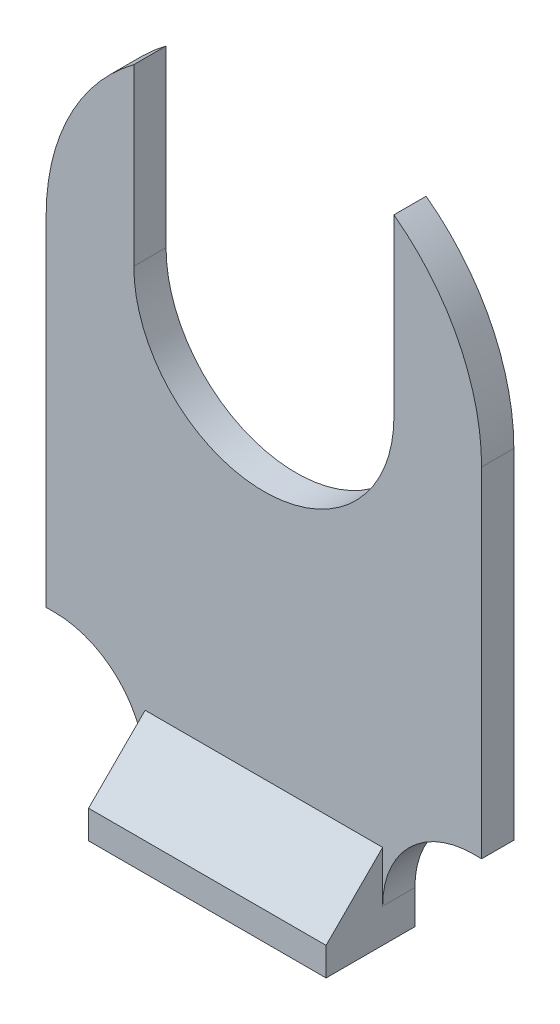
ISO-10303-21;
HEADER;
FILE_DESCRIPTION(('STEP AP214'),'2;1');
FILE_NAME('part.step','',(''),(''),'','','');
FILE_SCHEMA(('AUTOMOTIVE_DESIGN { 1 0 10303 214 1 1 1 1 }'));
ENDSEC;
DATA;
#1=APPLICATION_CONTEXT('core data for automotive mechanical design processes');
#2=APPLICATION_PROTOCOL_DEFINITION('international standard','automotive_design',2000,#1);
#3=PRODUCT_CONTEXT('',#1,'mechanical');
#4=PRODUCT('Part','Part','',(#3));
#5=PRODUCT_RELATED_PRODUCT_CATEGORY('part','',(#4));
#6=PRODUCT_DEFINITION_FORMATION('','',#4);
#7=PRODUCT_DEFINITION_CONTEXT('part definition',#1,'design');
#8=PRODUCT_DEFINITION('design','',#6,#7);
#9=PRODUCT_DEFINITION_SHAPE('','',#8);
#10=(LENGTH_UNIT() NAMED_UNIT(*) SI_UNIT(.MILLI.,.METRE.));
#11=(NAMED_UNIT(*) PLANE_ANGLE_UNIT() SI_UNIT($,.RADIAN.));
#12=(NAMED_UNIT(*) SI_UNIT($,.STERADIAN.) SOLID_ANGLE_UNIT());
#13=UNCERTAINTY_MEASURE_WITH_UNIT(LENGTH_MEASURE(1.E-05),#10,'distance_accuracy_value','');
#14=(GEOMETRIC_REPRESENTATION_CONTEXT(3) GLOBAL_UNCERTAINTY_ASSIGNED_CONTEXT((#13)) GLOBAL_UNIT_ASSIGNED_CONTEXT((#10,
#11,#12)) REPRESENTATION_CONTEXT('',''));
#15=CARTESIAN_POINT('',(0.,0.,0.));
#16=DIRECTION('',(0.,0.,1.));
#17=DIRECTION('',(1.,0.,0.));
#18=AXIS2_PLACEMENT_3D('',#15,#16,#17);
#19=CARTESIAN_POINT('',(0.,0.,1.24));
#20=DIRECTION('',(0.,0.,-1.));
#21=DIRECTION('',(-1.,0.,0.));
#22=AXIS2_PLACEMENT_3D('',#19,#20,#21);
#23=CYLINDRICAL_SURFACE('',#22,4.6);
#24=CARTESIAN_POINT('',(0.,0.,0.1));
#25=DIRECTION('',(0.,0.,1.));
#26=DIRECTION('',(-1.,0.,0.));
#27=AXIS2_PLACEMENT_3D('',#24,#25,#26);
#28=CIRCLE('',#27,4.6);
#29=CARTESIAN_POINT('',(-4.6,0.,0.1));
#30=VERTEX_POINT('',#29);
#31=CARTESIAN_POINT('',(4.6,0.,0.1));
#32=VERTEX_POINT('',#31);
#33=EDGE_CURVE('E271',#30,#32,#28,.T.);
#34=ORIENTED_EDGE('',*,*,#33,.F.);
#35=DIRECTION('',(0.,0.,-1.));
#36=VECTOR('',#35,1.);
#37=CARTESIAN_POINT('',(-4.6,0.,1.24));
#38=LINE('',#37,#36);
#39=CARTESIAN_POINT('',(-4.6,0.,1.24));
#40=VERTEX_POINT('',#39);
#41=EDGE_CURVE('E220',#40,#30,#38,.T.);
#42=ORIENTED_EDGE('',*,*,#41,.F.);
#43=CARTESIAN_POINT('',(0.,0.,1.24));
#44=DIRECTION('',(0.,0.,-1.));
#45=DIRECTION('',(1.,0.,0.));
#46=AXIS2_PLACEMENT_3D('',#43,#44,#45);
#47=CIRCLE('',#46,4.6);
#48=CARTESIAN_POINT('',(4.6,0.,1.24));
#49=VERTEX_POINT('',#48);
#50=EDGE_CURVE('E186',#49,#40,#47,.T.);
#51=ORIENTED_EDGE('',*,*,#50,.F.);
#52=DIRECTION('',(0.,0.,-1.));
#53=VECTOR('',#52,1.);
#54=CARTESIAN_POINT('',(4.6,0.,1.24));
#55=LINE('',#54,#53);
#56=EDGE_CURVE('E205',#49,#32,#55,.T.);
#57=ORIENTED_EDGE('',*,*,#56,.T.);
#58=EDGE_LOOP('',(#34,#42,#51,#57));
#59=FACE_BOUND('',#58,.T.);
#60=ADVANCED_FACE('F36',(#59),#23,.F.);
#61=CARTESIAN_POINT('',(-4.6,0.,1.24));
#62=DIRECTION('',(-1.,0.,0.));
#63=DIRECTION('',(0.,0.,1.));
#64=AXIS2_PLACEMENT_3D('',#61,#62,#63);
#65=PLANE('',#64);
#66=DIRECTION('',(0.,-1.,0.));
#67=VECTOR('',#66,1.);
#68=CARTESIAN_POINT('',(-4.6,6.17494939250517,0.1));
#69=LINE('',#68,#67);
#70=CARTESIAN_POINT('',(-4.6,6.17494939250517,0.1));
#71=VERTEX_POINT('',#70);
#72=EDGE_CURVE('E273',#71,#30,#69,.T.);
#73=ORIENTED_EDGE('',*,*,#72,.F.);
#74=DIRECTION('',(0.,0.,-1.));
#75=VECTOR('',#74,1.);
#76=CARTESIAN_POINT('',(-4.6,6.17494939250517,1.24));
#77=LINE('',#76,#75);
#78=CARTESIAN_POINT('',(-4.6,6.17494939250517,1.24));
#79=VERTEX_POINT('',#78);
#80=EDGE_CURVE('E217',#79,#71,#77,.T.);
#81=ORIENTED_EDGE('',*,*,#80,.F.);
#82=DIRECTION('',(0.,1.,0.));
#83=VECTOR('',#82,1.);
#84=CARTESIAN_POINT('',(-4.6,0.,1.24));
#85=LINE('',#84,#83);
#86=EDGE_CURVE('E192',#40,#79,#85,.T.);
#87=ORIENTED_EDGE('',*,*,#86,.F.);
#88=ORIENTED_EDGE('',*,*,#41,.T.);
#89=EDGE_LOOP('',(#73,#81,#87,#88));
#90=FACE_BOUND('',#89,.T.);
#91=ADVANCED_FACE('F300',(#90),#65,.F.);
#92=CARTESIAN_POINT('',(0.,0.,1.24));
#93=DIRECTION('',(0.,0.,-1.));
#94=DIRECTION('',(-1.,0.,0.));
#95=AXIS2_PLACEMENT_3D('',#92,#93,#94);
#96=CYLINDRICAL_SURFACE('',#95,7.7);
#97=CARTESIAN_POINT('',(0.,0.,0.1));
#98=DIRECTION('',(0.,0.,-1.));
#99=DIRECTION('',(-1.,0.,0.));
#100=AXIS2_PLACEMENT_3D('',#97,#98,#99);
#101=CIRCLE('',#100,7.7);
#102=CARTESIAN_POINT('',(-7.7,0.,0.1));
#103=VERTEX_POINT('',#102);
#104=EDGE_CURVE('E275',#103,#71,#101,.T.);
#105=ORIENTED_EDGE('',*,*,#104,.F.);
#106=DIRECTION('',(0.,0.,-1.));
#107=VECTOR('',#106,1.);
#108=CARTESIAN_POINT('',(-7.7,0.,1.24));
#109=LINE('',#108,#107);
#110=CARTESIAN_POINT('',(-7.7,0.,1.24));
#111=VERTEX_POINT('',#110);
#112=EDGE_CURVE('E214',#111,#103,#109,.T.);
#113=ORIENTED_EDGE('',*,*,#112,.F.);
#114=CARTESIAN_POINT('',(0.,0.,1.24));
#115=DIRECTION('',(0.,0.,1.));
#116=DIRECTION('',(1.,0.,0.));
#117=AXIS2_PLACEMENT_3D('',#114,#115,#116);
#118=CIRCLE('',#117,7.7);
#119=EDGE_CURVE('E194',#79,#111,#118,.T.);
#120=ORIENTED_EDGE('',*,*,#119,.F.);
#121=ORIENTED_EDGE('',*,*,#80,.T.);
#122=EDGE_LOOP('',(#105,#113,#120,#121));
#123=FACE_BOUND('',#122,.T.);
#124=ADVANCED_FACE('F305',(#123),#96,.T.);
#125=CARTESIAN_POINT('',(-7.7,-20.6,1.24));
#126=DIRECTION('',(1.,0.,0.));
#127=DIRECTION('',(0.,1.,0.));
#128=AXIS2_PLACEMENT_3D('',#125,#126,#127);
#129=PLANE('',#128);
#130=DIRECTION('',(0.,1.,0.));
#131=VECTOR('',#130,1.);
#132=CARTESIAN_POINT('',(-7.7,-12.,0.1));
#133=LINE('',#132,#131);
#134=CARTESIAN_POINT('',(-7.7,-12.,0.1));
#135=VERTEX_POINT('',#134);
#136=EDGE_CURVE('E277',#135,#103,#133,.T.);
#137=ORIENTED_EDGE('',*,*,#136,.F.);
#138=DIRECTION('',(0.,0.,1.));
#139=VECTOR('',#138,1.);
#140=CARTESIAN_POINT('',(-7.7,-12.,-9.28493403315286));
#141=LINE('',#140,#139);
#142=CARTESIAN_POINT('',(-7.7,-12.,1.24));
#143=VERTEX_POINT('',#142);
#144=EDGE_CURVE('E184',#135,#143,#141,.T.);
#145=ORIENTED_EDGE('',*,*,#144,.T.);
#146=DIRECTION('',(0.,-1.,0.));
#147=VECTOR('',#146,1.);
#148=CARTESIAN_POINT('',(-7.7,-20.6,1.24));
#149=LINE('',#148,#147);
#150=EDGE_CURVE('E196',#111,#143,#149,.T.);
#151=ORIENTED_EDGE('',*,*,#150,.F.);
#152=ORIENTED_EDGE('',*,*,#112,.T.);
#153=EDGE_LOOP('',(#137,#145,#151,#152));
#154=FACE_BOUND('',#153,.T.);
#155=ADVANCED_FACE('F312',(#154),#129,.F.);
#156=CARTESIAN_POINT('',(7.7,-20.6,1.24));
#157=DIRECTION('',(-1.,0.,0.));
#158=DIRECTION('',(0.,-1.,0.));
#159=AXIS2_PLACEMENT_3D('',#156,#157,#158);
#160=PLANE('',#159);
#161=DIRECTION('',(0.,-1.,0.));
#162=VECTOR('',#161,1.);
#163=CARTESIAN_POINT('',(7.7,0.,0.1));
#164=LINE('',#163,#162);
#165=CARTESIAN_POINT('',(7.7,0.,0.1));
#166=VERTEX_POINT('',#165);
#167=CARTESIAN_POINT('',(7.7,-12.,0.1));
#168=VERTEX_POINT('',#167);
#169=EDGE_CURVE('E244',#166,#168,#164,.T.);
#170=ORIENTED_EDGE('',*,*,#169,.F.);
#171=DIRECTION('',(0.,0.,-1.));
#172=VECTOR('',#171,1.);
#173=CARTESIAN_POINT('',(7.7,0.,1.24));
#174=LINE('',#173,#172);
#175=CARTESIAN_POINT('',(7.7,0.,1.24));
#176=VERTEX_POINT('',#175);
#177=EDGE_CURVE('E211',#176,#166,#174,.T.);
#178=ORIENTED_EDGE('',*,*,#177,.F.);
#179=DIRECTION('',(0.,1.,0.));
#180=VECTOR('',#179,1.);
#181=CARTESIAN_POINT('',(7.7,-20.6,1.24));
#182=LINE('',#181,#180);
#183=CARTESIAN_POINT('',(7.7,-12.,1.24));
#184=VERTEX_POINT('',#183);
#185=EDGE_CURVE('E199',#184,#176,#182,.T.);
#186=ORIENTED_EDGE('',*,*,#185,.F.);
#187=DIRECTION('',(0.,0.,1.));
#188=VECTOR('',#187,1.);
#189=CARTESIAN_POINT('',(7.7,-12.,-9.28493403315286));
#190=LINE('',#189,#188);
#191=EDGE_CURVE('E168',#168,#184,#190,.T.);
#192=ORIENTED_EDGE('',*,*,#191,.F.);
#193=EDGE_LOOP('',(#170,#178,#186,#192));
#194=FACE_BOUND('',#193,.T.);
#195=ADVANCED_FACE('F316',(#194),#160,.F.);
#196=CARTESIAN_POINT('',(0.,0.,1.24));
#197=DIRECTION('',(0.,0.,-1.));
#198=DIRECTION('',(-1.,0.,0.));
#199=AXIS2_PLACEMENT_3D('',#196,#197,#198);
#200=CYLINDRICAL_SURFACE('',#199,7.7);
#201=CARTESIAN_POINT('',(0.,0.,0.1));
#202=DIRECTION('',(0.,0.,-1.));
#203=DIRECTION('',(-1.,0.,0.));
#204=AXIS2_PLACEMENT_3D('',#201,#202,#203);
#205=CIRCLE('',#204,7.7);
#206=CARTESIAN_POINT('',(4.6,6.17494939250517,0.1));
#207=VERTEX_POINT('',#206);
#208=EDGE_CURVE('E267',#207,#166,#205,.T.);
#209=ORIENTED_EDGE('',*,*,#208,.F.);
#210=DIRECTION('',(0.,0.,-1.));
#211=VECTOR('',#210,1.);
#212=CARTESIAN_POINT('',(4.6,6.17494939250517,1.24));
#213=LINE('',#212,#211);
#214=CARTESIAN_POINT('',(4.6,6.17494939250517,1.24));
#215=VERTEX_POINT('',#214);
#216=EDGE_CURVE('E208',#215,#207,#213,.T.);
#217=ORIENTED_EDGE('',*,*,#216,.F.);
#218=CARTESIAN_POINT('',(0.,0.,1.24));
#219=DIRECTION('',(0.,0.,1.));
#220=DIRECTION('',(1.,0.,0.));
#221=AXIS2_PLACEMENT_3D('',#218,#219,#220);
#222=CIRCLE('',#221,7.7);
#223=EDGE_CURVE('E201',#176,#215,#222,.T.);
#224=ORIENTED_EDGE('',*,*,#223,.F.);
#225=ORIENTED_EDGE('',*,*,#177,.T.);
#226=EDGE_LOOP('',(#209,#217,#224,#225));
#227=FACE_BOUND('',#226,.T.);
#228=ADVANCED_FACE('F320',(#227),#200,.T.);
#229=CARTESIAN_POINT('',(4.6,0.,1.24));
#230=DIRECTION('',(1.,0.,0.));
#231=DIRECTION('',(0.,0.,-1.));
#232=AXIS2_PLACEMENT_3D('',#229,#230,#231);
#233=PLANE('',#232);
#234=DIRECTION('',(0.,1.,0.));
#235=VECTOR('',#234,1.);
#236=CARTESIAN_POINT('',(4.6,0.,0.1));
#237=LINE('',#236,#235);
#238=EDGE_CURVE('E269',#32,#207,#237,.T.);
#239=ORIENTED_EDGE('',*,*,#238,.F.);
#240=ORIENTED_EDGE('',*,*,#56,.F.);
#241=DIRECTION('',(0.,-1.,0.));
#242=VECTOR('',#241,1.);
#243=CARTESIAN_POINT('',(4.6,0.,1.24));
#244=LINE('',#243,#242);
#245=EDGE_CURVE('E203',#215,#49,#244,.T.);
#246=ORIENTED_EDGE('',*,*,#245,.F.);
#247=ORIENTED_EDGE('',*,*,#216,.T.);
#248=EDGE_LOOP('',(#239,#240,#246,#247));
#249=FACE_BOUND('',#248,.T.);
#250=ADVANCED_FACE('F324',(#249),#233,.F.);
#251=CARTESIAN_POINT('',(-7.7,-12.,-9.28493403315286));
#252=DIRECTION('',(0.,1.,0.));
#253=DIRECTION('',(-1.,0.,0.));
#254=AXIS2_PLACEMENT_3D('',#251,#252,#253);
#255=PLANE('',#254);
#256=DIRECTION('',(-1.,0.,0.));
#257=VECTOR('',#256,1.);
#258=CARTESIAN_POINT('',(-7.4,-12.,0.1));
#259=LINE('',#258,#257);
#260=CARTESIAN_POINT('',(-7.4,-12.,0.1));
#261=VERTEX_POINT('',#260);
#262=EDGE_CURVE('E279',#261,#135,#259,.T.);
#263=ORIENTED_EDGE('',*,*,#262,.F.);
#264=DIRECTION('',(0.,0.,1.));
#265=VECTOR('',#264,1.);
#266=CARTESIAN_POINT('',(-7.4,-12.,-9.28493403315286));
#267=LINE('',#266,#265);
#268=CARTESIAN_POINT('',(-7.4,-12.,1.24));
#269=VERTEX_POINT('',#268);
#270=EDGE_CURVE('E187',#261,#269,#267,.T.);
#271=ORIENTED_EDGE('',*,*,#270,.T.);
#272=DIRECTION('',(-1.,0.,0.));
#273=VECTOR('',#272,1.);
#274=CARTESIAN_POINT('',(-7.7,-12.,1.24));
#275=LINE('',#274,#273);
#276=EDGE_CURVE('E180',#269,#143,#275,.T.);
#277=ORIENTED_EDGE('',*,*,#276,.T.);
#278=ORIENTED_EDGE('',*,*,#144,.F.);
#279=EDGE_LOOP('',(#263,#271,#277,#278));
#280=FACE_BOUND('',#279,.T.);
#281=ADVANCED_FACE('F327',(#280),#255,.F.);
#282=CARTESIAN_POINT('',(-7.4,-15.2,-9.28493403315286));
#283=DIRECTION('',(0.,0.,1.));
#284=DIRECTION('',(1.,0.,0.));
#285=AXIS2_PLACEMENT_3D('',#282,#283,#284);
#286=CYLINDRICAL_SURFACE('',#285,3.2);
#287=CARTESIAN_POINT('',(-7.4,-15.2,0.1));
#288=DIRECTION('',(0.,0.,1.));
#289=DIRECTION('',(-1.,0.,0.));
#290=AXIS2_PLACEMENT_3D('',#287,#288,#289);
#291=CIRCLE('',#290,3.2);
#292=CARTESIAN_POINT('',(-4.2,-15.2,0.1));
#293=VERTEX_POINT('',#292);
#294=EDGE_CURVE('E281',#293,#261,#291,.T.);
#295=ORIENTED_EDGE('',*,*,#294,.F.);
#296=DIRECTION('',(0.,0.,1.));
#297=VECTOR('',#296,1.);
#298=CARTESIAN_POINT('',(-4.2,-15.2,-9.28493403315286));
#299=LINE('',#298,#297);
#300=CARTESIAN_POINT('',(-4.2,-15.2,1.24));
#301=VERTEX_POINT('',#300);
#302=EDGE_CURVE('E183',#293,#301,#299,.T.);
#303=ORIENTED_EDGE('',*,*,#302,.T.);
#304=CARTESIAN_POINT('',(-7.4,-15.2,1.24));
#305=DIRECTION('',(0.,0.,1.));
#306=DIRECTION('',(1.,0.,0.));
#307=AXIS2_PLACEMENT_3D('',#304,#305,#306);
#308=CIRCLE('',#307,3.2);
#309=EDGE_CURVE('E177',#301,#269,#308,.T.);
#310=ORIENTED_EDGE('',*,*,#309,.T.);
#311=ORIENTED_EDGE('',*,*,#270,.F.);
#312=EDGE_LOOP('',(#295,#303,#310,#311));
#313=FACE_BOUND('',#312,.T.);
#314=ADVANCED_FACE('F332',(#313),#286,.F.);
#315=CARTESIAN_POINT('',(-4.2,-20.6,-9.28493403315286));
#316=DIRECTION('',(1.,0.,0.));
#317=DIRECTION('',(0.,0.,-1.));
#318=AXIS2_PLACEMENT_3D('',#315,#316,#317);
#319=PLANE('',#318);
#320=DIRECTION('',(0.,1.,0.));
#321=VECTOR('',#320,1.);
#322=CARTESIAN_POINT('',(-4.2,-16.4,0.1));
#323=LINE('',#322,#321);
#324=CARTESIAN_POINT('',(-4.2,-16.4,0.1));
#325=VERTEX_POINT('',#324);
#326=EDGE_CURVE('E283',#325,#293,#323,.T.);
#327=ORIENTED_EDGE('',*,*,#326,.F.);
#328=DIRECTION('',(0.,0.,1.));
#329=VECTOR('',#328,1.);
#330=CARTESIAN_POINT('',(-4.2,-16.4,0.));
#331=LINE('',#330,#329);
#332=CARTESIAN_POINT('',(-4.2,-16.4,3.24));
#333=VERTEX_POINT('',#332);
#334=EDGE_CURVE('E249',#325,#333,#331,.T.);
#335=ORIENTED_EDGE('',*,*,#334,.T.);
#336=DIRECTION('',(0.,-1.,0.));
#337=VECTOR('',#336,1.);
#338=CARTESIAN_POINT('',(-4.2,-16.4,3.24));
#339=LINE('',#338,#337);
#340=CARTESIAN_POINT('',(-4.2,-15.4,3.24));
#341=VERTEX_POINT('',#340);
#342=EDGE_CURVE('E234',#341,#333,#339,.T.);
#343=ORIENTED_EDGE('',*,*,#342,.F.);
#344=DIRECTION('',(0.,0.707106781186546,-0.707106781186549));
#345=VECTOR('',#344,1.);
#346=CARTESIAN_POINT('',(-4.2,-15.4,3.24));
#347=LINE('',#346,#345);
#348=CARTESIAN_POINT('',(-4.2,-13.4,1.24));
#349=VERTEX_POINT('',#348);
#350=EDGE_CURVE('E44',#341,#349,#347,.T.);
#351=ORIENTED_EDGE('',*,*,#350,.T.);
#352=DIRECTION('',(0.,-1.,0.));
#353=VECTOR('',#352,1.);
#354=CARTESIAN_POINT('',(-4.2,-16.4,1.24));
#355=LINE('',#354,#353);
#356=EDGE_CURVE('E232',#349,#301,#355,.T.);
#357=ORIENTED_EDGE('',*,*,#356,.T.);
#358=ORIENTED_EDGE('',*,*,#302,.F.);
#359=EDGE_LOOP('',(#327,#335,#343,#351,#357,#358));
#360=FACE_BOUND('',#359,.T.);
#361=ADVANCED_FACE('F230',(#360),#319,.F.);
#362=CARTESIAN_POINT('',(7.4,-15.2,-9.28493403315286));
#363=DIRECTION('',(0.,0.,1.));
#364=DIRECTION('',(1.,0.,0.));
#365=AXIS2_PLACEMENT_3D('',#362,#363,#364);
#366=CYLINDRICAL_SURFACE('',#365,3.2);
#367=CARTESIAN_POINT('',(7.4,-15.2,0.1));
#368=DIRECTION('',(0.,0.,1.));
#369=DIRECTION('',(-1.,0.,0.));
#370=AXIS2_PLACEMENT_3D('',#367,#368,#369);
#371=CIRCLE('',#370,3.2);
#372=CARTESIAN_POINT('',(7.4,-12.,0.1));
#373=VERTEX_POINT('',#372);
#374=CARTESIAN_POINT('',(4.2,-15.2,0.1));
#375=VERTEX_POINT('',#374);
#376=EDGE_CURVE('E146',#373,#375,#371,.T.);
#377=ORIENTED_EDGE('',*,*,#376,.F.);
#378=DIRECTION('',(0.,0.,1.));
#379=VECTOR('',#378,1.);
#380=CARTESIAN_POINT('',(7.4,-12.,-9.28493403315286));
#381=LINE('',#380,#379);
#382=CARTESIAN_POINT('',(7.4,-12.,1.24));
#383=VERTEX_POINT('',#382);
#384=EDGE_CURVE('E171',#373,#383,#381,.T.);
#385=ORIENTED_EDGE('',*,*,#384,.T.);
#386=CARTESIAN_POINT('',(7.4,-15.2,1.24));
#387=DIRECTION('',(0.,0.,1.));
#388=DIRECTION('',(-1.,0.,0.));
#389=AXIS2_PLACEMENT_3D('',#386,#387,#388);
#390=CIRCLE('',#389,3.2);
#391=CARTESIAN_POINT('',(4.2,-15.2,1.24));
#392=VERTEX_POINT('',#391);
#393=EDGE_CURVE('E167',#383,#392,#390,.T.);
#394=ORIENTED_EDGE('',*,*,#393,.T.);
#395=DIRECTION('',(0.,0.,1.));
#396=VECTOR('',#395,1.);
#397=CARTESIAN_POINT('',(4.2,-15.2,-9.28493403315286));
#398=LINE('',#397,#396);
#399=EDGE_CURVE('E158',#375,#392,#398,.T.);
#400=ORIENTED_EDGE('',*,*,#399,.F.);
#401=EDGE_LOOP('',(#377,#385,#394,#400));
#402=FACE_BOUND('',#401,.T.);
#403=ADVANCED_FACE('F165',(#402),#366,.F.);
#404=CARTESIAN_POINT('',(7.7,-12.,-9.28493403315286));
#405=DIRECTION('',(0.,1.,0.));
#406=DIRECTION('',(-1.,0.,0.));
#407=AXIS2_PLACEMENT_3D('',#404,#405,#406);
#408=PLANE('',#407);
#409=DIRECTION('',(-1.,0.,0.));
#410=VECTOR('',#409,1.);
#411=CARTESIAN_POINT('',(7.7,-12.,0.1));
#412=LINE('',#411,#410);
#413=EDGE_CURVE('E149',#168,#373,#412,.T.);
#414=ORIENTED_EDGE('',*,*,#413,.F.);
#415=ORIENTED_EDGE('',*,*,#191,.T.);
#416=DIRECTION('',(-1.,0.,0.));
#417=VECTOR('',#416,1.);
#418=CARTESIAN_POINT('',(7.7,-12.,1.24));
#419=LINE('',#418,#417);
#420=EDGE_CURVE('E169',#184,#383,#419,.T.);
#421=ORIENTED_EDGE('',*,*,#420,.T.);
#422=ORIENTED_EDGE('',*,*,#384,.F.);
#423=EDGE_LOOP('',(#414,#415,#421,#422));
#424=FACE_BOUND('',#423,.T.);
#425=ADVANCED_FACE('F255',(#424),#408,.F.);
#426=CARTESIAN_POINT('',(4.2,-20.6,-9.28493403315286));
#427=DIRECTION('',(-1.,0.,0.));
#428=DIRECTION('',(0.,0.,1.));
#429=AXIS2_PLACEMENT_3D('',#426,#427,#428);
#430=PLANE('',#429);
#431=DIRECTION('',(0.,-1.,0.));
#432=VECTOR('',#431,1.);
#433=CARTESIAN_POINT('',(4.2,-15.2,0.1));
#434=LINE('',#433,#432);
#435=CARTESIAN_POINT('',(4.2,-16.4,0.1));
#436=VERTEX_POINT('',#435);
#437=EDGE_CURVE('E51',#375,#436,#434,.T.);
#438=ORIENTED_EDGE('',*,*,#437,.F.);
#439=ORIENTED_EDGE('',*,*,#399,.T.);
#440=DIRECTION('',(0.,1.,0.));
#441=VECTOR('',#440,1.);
#442=CARTESIAN_POINT('',(4.2,-16.4,1.24));
#443=LINE('',#442,#441);
#444=CARTESIAN_POINT('',(4.2,-13.4,1.24));
#445=VERTEX_POINT('',#444);
#446=EDGE_CURVE('E223',#392,#445,#443,.T.);
#447=ORIENTED_EDGE('',*,*,#446,.T.);
#448=DIRECTION('',(0.,-0.707106781186546,0.707106781186549));
#449=VECTOR('',#448,1.);
#450=CARTESIAN_POINT('',(4.2,-15.4,3.24));
#451=LINE('',#450,#449);
#452=CARTESIAN_POINT('',(4.2,-15.4,3.24));
#453=VERTEX_POINT('',#452);
#454=EDGE_CURVE('E11',#445,#453,#451,.T.);
#455=ORIENTED_EDGE('',*,*,#454,.T.);
#456=DIRECTION('',(0.,1.,0.));
#457=VECTOR('',#456,1.);
#458=CARTESIAN_POINT('',(4.2,-16.4,3.24));
#459=LINE('',#458,#457);
#460=CARTESIAN_POINT('',(4.2,-16.4,3.24));
#461=VERTEX_POINT('',#460);
#462=EDGE_CURVE('E240',#461,#453,#459,.T.);
#463=ORIENTED_EDGE('',*,*,#462,.F.);
#464=DIRECTION('',(0.,0.,1.));
#465=VECTOR('',#464,1.);
#466=CARTESIAN_POINT('',(4.2,-16.4,0.));
#467=LINE('',#466,#465);
#468=EDGE_CURVE('E161',#436,#461,#467,.T.);
#469=ORIENTED_EDGE('',*,*,#468,.F.);
#470=EDGE_LOOP('',(#438,#439,#447,#455,#463,#469));
#471=FACE_BOUND('',#470,.T.);
#472=ADVANCED_FACE('F156',(#471),#430,.F.);
#473=CARTESIAN_POINT('',(-4.2,-16.4,0.));
#474=DIRECTION('',(0.,1.,0.));
#475=DIRECTION('',(0.,0.,1.));
#476=AXIS2_PLACEMENT_3D('',#473,#474,#475);
#477=PLANE('',#476);
#478=DIRECTION('',(-1.,0.,0.));
#479=VECTOR('',#478,1.);
#480=CARTESIAN_POINT('',(4.2,-16.4,0.1));
#481=LINE('',#480,#479);
#482=EDGE_CURVE('E162',#436,#325,#481,.T.);
#483=ORIENTED_EDGE('',*,*,#482,.F.);
#484=ORIENTED_EDGE('',*,*,#468,.T.);
#485=DIRECTION('',(1.,0.,0.));
#486=VECTOR('',#485,1.);
#487=CARTESIAN_POINT('',(4.2,-16.4,3.24));
#488=LINE('',#487,#486);
#489=EDGE_CURVE('E252',#333,#461,#488,.T.);
#490=ORIENTED_EDGE('',*,*,#489,.F.);
#491=ORIENTED_EDGE('',*,*,#334,.F.);
#492=EDGE_LOOP('',(#483,#484,#490,#491));
#493=FACE_BOUND('',#492,.T.);
#494=ADVANCED_FACE('F288',(#493),#477,.F.);
#495=CARTESIAN_POINT('',(0.,0.,1.24));
#496=DIRECTION('',(0.,0.,1.));
#497=DIRECTION('',(1.,0.,0.));
#498=AXIS2_PLACEMENT_3D('',#495,#496,#497);
#499=PLANE('',#498);
#500=ORIENTED_EDGE('',*,*,#446,.F.);
#501=ORIENTED_EDGE('',*,*,#393,.F.);
#502=ORIENTED_EDGE('',*,*,#420,.F.);
#503=ORIENTED_EDGE('',*,*,#185,.T.);
#504=ORIENTED_EDGE('',*,*,#223,.T.);
#505=ORIENTED_EDGE('',*,*,#245,.T.);
#506=ORIENTED_EDGE('',*,*,#50,.T.);
#507=ORIENTED_EDGE('',*,*,#86,.T.);
#508=ORIENTED_EDGE('',*,*,#119,.T.);
#509=ORIENTED_EDGE('',*,*,#150,.T.);
#510=ORIENTED_EDGE('',*,*,#276,.F.);
#511=ORIENTED_EDGE('',*,*,#309,.F.);
#512=ORIENTED_EDGE('',*,*,#356,.F.);
#513=DIRECTION('',(-1.,0.,0.));
#514=VECTOR('',#513,1.);
#515=CARTESIAN_POINT('',(4.2,-13.4,1.24));
#516=LINE('',#515,#514);
#517=EDGE_CURVE('E238',#445,#349,#516,.T.);
#518=ORIENTED_EDGE('',*,*,#517,.F.);
#519=EDGE_LOOP('',(#500,#501,#502,#503,#504,#505,#506,#507,#508,#509,#510,#511,#512,#518));
#520=FACE_BOUND('',#519,.T.);
#521=ADVANCED_FACE('F237',(#520),#499,.T.);
#522=CARTESIAN_POINT('',(0.,0.,3.24));
#523=DIRECTION('',(0.,0.,1.));
#524=DIRECTION('',(1.,0.,0.));
#525=AXIS2_PLACEMENT_3D('',#522,#523,#524);
#526=PLANE('',#525);
#527=ORIENTED_EDGE('',*,*,#462,.T.);
#528=DIRECTION('',(-1.,0.,0.));
#529=VECTOR('',#528,1.);
#530=CARTESIAN_POINT('',(-4.2,-15.4,3.24));
#531=LINE('',#530,#529);
#532=EDGE_CURVE('E224',#453,#341,#531,.T.);
#533=ORIENTED_EDGE('',*,*,#532,.T.);
#534=ORIENTED_EDGE('',*,*,#342,.T.);
#535=ORIENTED_EDGE('',*,*,#489,.T.);
#536=EDGE_LOOP('',(#527,#533,#534,#535));
#537=FACE_BOUND('',#536,.T.);
#538=ADVANCED_FACE('F261',(#537),#526,.T.);
#539=CARTESIAN_POINT('',(0.,-15.4,3.24));
#540=DIRECTION('',(0.,0.707106781186549,0.707106781186546));
#541=DIRECTION('',(1.,0.,0.));
#542=AXIS2_PLACEMENT_3D('',#539,#540,#541);
#543=PLANE('',#542);
#544=ORIENTED_EDGE('',*,*,#454,.F.);
#545=ORIENTED_EDGE('',*,*,#517,.T.);
#546=ORIENTED_EDGE('',*,*,#350,.F.);
#547=ORIENTED_EDGE('',*,*,#532,.F.);
#548=EDGE_LOOP('',(#544,#545,#546,#547));
#549=FACE_BOUND('',#548,.T.);
#550=ADVANCED_FACE('F38',(#549),#543,.T.);
#551=CARTESIAN_POINT('',(7.4,-15.2,0.1));
#552=DIRECTION('',(0.,0.,-1.));
#553=DIRECTION('',(-1.,0.,0.));
#554=AXIS2_PLACEMENT_3D('',#551,#552,#553);
#555=PLANE('',#554);
#556=ORIENTED_EDGE('',*,*,#376,.T.);
#557=ORIENTED_EDGE('',*,*,#437,.T.);
#558=ORIENTED_EDGE('',*,*,#482,.T.);
#559=ORIENTED_EDGE('',*,*,#326,.T.);
#560=ORIENTED_EDGE('',*,*,#294,.T.);
#561=ORIENTED_EDGE('',*,*,#262,.T.);
#562=ORIENTED_EDGE('',*,*,#136,.T.);
#563=ORIENTED_EDGE('',*,*,#104,.T.);
#564=ORIENTED_EDGE('',*,*,#72,.T.);
#565=ORIENTED_EDGE('',*,*,#33,.T.);
#566=ORIENTED_EDGE('',*,*,#238,.T.);
#567=ORIENTED_EDGE('',*,*,#208,.T.);
#568=ORIENTED_EDGE('',*,*,#169,.T.);
#569=ORIENTED_EDGE('',*,*,#413,.T.);
#570=EDGE_LOOP('',(#556,#557,#558,#559,#560,#561,#562,#563,#564,#565,#566,#567,#568,#569));
#571=FACE_BOUND('',#570,.T.);
#572=ADVANCED_FACE('F147',(#571),#555,.T.);
#573=CLOSED_SHELL('',(#60,#91,#124,#155,#195,#228,#250,#281,#314,#361,#403,#425,#472,#494,#521,
#538,#550,#572));
#574=MANIFOLD_SOLID_BREP('B2',#573);
#575=ADVANCED_BREP_SHAPE_REPRESENTATION('',(#18,#574),#14);
#576=SHAPE_DEFINITION_REPRESENTATION(#9,#575);
ENDSEC;
END-ISO-10303-21;
